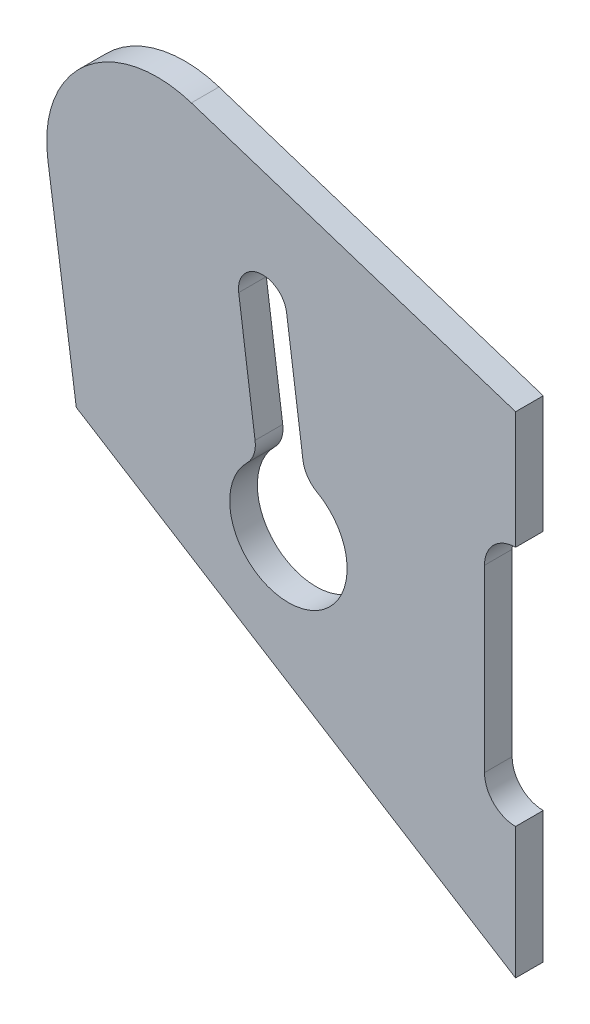
ISO-10303-21;
HEADER;
FILE_DESCRIPTION(('STEP AP214'),'2;1');
FILE_NAME('part.step','',(''),(''),'','','');
FILE_SCHEMA(('AUTOMOTIVE_DESIGN { 1 0 10303 214 1 1 1 1 }'));
ENDSEC;
DATA;
#1=APPLICATION_CONTEXT('core data for automotive mechanical design processes');
#2=APPLICATION_PROTOCOL_DEFINITION('international standard','automotive_design',2000,#1);
#3=PRODUCT_CONTEXT('',#1,'mechanical');
#4=PRODUCT('Part','Part','',(#3));
#5=PRODUCT_RELATED_PRODUCT_CATEGORY('part','',(#4));
#6=PRODUCT_DEFINITION_FORMATION('','',#4);
#7=PRODUCT_DEFINITION_CONTEXT('part definition',#1,'design');
#8=PRODUCT_DEFINITION('design','',#6,#7);
#9=PRODUCT_DEFINITION_SHAPE('','',#8);
#10=(LENGTH_UNIT() NAMED_UNIT(*) SI_UNIT(.MILLI.,.METRE.));
#11=(NAMED_UNIT(*) PLANE_ANGLE_UNIT() SI_UNIT($,.RADIAN.));
#12=(NAMED_UNIT(*) SI_UNIT($,.STERADIAN.) SOLID_ANGLE_UNIT());
#13=UNCERTAINTY_MEASURE_WITH_UNIT(LENGTH_MEASURE(1.E-05),#10,'distance_accuracy_value','');
#14=(GEOMETRIC_REPRESENTATION_CONTEXT(3) GLOBAL_UNCERTAINTY_ASSIGNED_CONTEXT((#13)) GLOBAL_UNIT_ASSIGNED_CONTEXT((#10,
#11,#12)) REPRESENTATION_CONTEXT('',''));
#15=CARTESIAN_POINT('',(0.,0.,0.));
#16=DIRECTION('',(0.,0.,1.));
#17=DIRECTION('',(1.,0.,0.));
#18=AXIS2_PLACEMENT_3D('',#15,#16,#17);
#19=CARTESIAN_POINT('',(-47.1056972620298,-6.45501762164483,8.));
#20=DIRECTION('',(0.990741222484138,0.135763876162386,0.));
#21=DIRECTION('',(-0.135763876162386,0.990741222484138,0.));
#22=AXIS2_PLACEMENT_3D('',#19,#20,#21);
#23=PLANE('',#22);
#24=DIRECTION('',(0.135763876162386,-0.990741222484138,0.));
#25=VECTOR('',#24,1.);
#26=CARTESIAN_POINT('',(-47.1056972620298,-6.45501762164483,0.));
#27=LINE('',#26,#25);
#28=CARTESIAN_POINT('',(-66.3095583813064,133.685772252171,0.));
#29=VERTEX_POINT('',#28);
#30=CARTESIAN_POINT('',(-61.5578227156229,99.0098294652265,0.));
#31=VERTEX_POINT('',#30);
#32=EDGE_CURVE('E211',#29,#31,#27,.T.);
#33=ORIENTED_EDGE('',*,*,#32,.T.);
#34=DIRECTION('',(0.,0.,-1.));
#35=VECTOR('',#34,1.);
#36=CARTESIAN_POINT('',(-61.5578227156229,99.0098294652265,8.));
#37=LINE('',#36,#35);
#38=CARTESIAN_POINT('',(-61.5578227156229,99.0098294652265,8.));
#39=VERTEX_POINT('',#38);
#40=EDGE_CURVE('E11',#39,#31,#37,.T.);
#41=ORIENTED_EDGE('',*,*,#40,.F.);
#42=DIRECTION('',(0.135763876162386,-0.990741222484138,0.));
#43=VECTOR('',#42,1.);
#44=CARTESIAN_POINT('',(-47.1056972620298,-6.45501762164483,8.));
#45=LINE('',#44,#43);
#46=CARTESIAN_POINT('',(-66.3095583813064,133.685772252171,8.));
#47=VERTEX_POINT('',#46);
#48=EDGE_CURVE('E433',#47,#39,#45,.T.);
#49=ORIENTED_EDGE('',*,*,#48,.F.);
#50=DIRECTION('',(0.,0.,-1.));
#51=VECTOR('',#50,1.);
#52=CARTESIAN_POINT('',(-66.3095583813064,133.685772252171,8.));
#53=LINE('',#52,#51);
#54=EDGE_CURVE('E60',#47,#29,#53,.T.);
#55=ORIENTED_EDGE('',*,*,#54,.T.);
#56=EDGE_LOOP('',(#33,#41,#49,#55));
#57=FACE_BOUND('',#56,.T.);
#58=ADVANCED_FACE('F41',(#57),#23,.F.);
#59=CARTESIAN_POINT('',(-53.6318929357498,100.095940474526,8.));
#60=DIRECTION('',(0.,0.,-1.));
#61=DIRECTION('',(-1.,0.,0.));
#62=AXIS2_PLACEMENT_3D('',#59,#60,#61);
#63=CYLINDRICAL_SURFACE('',#62,7.99999999999998);
#64=CARTESIAN_POINT('',(-53.6318929357498,100.095940474526,0.));
#65=DIRECTION('',(0.,0.,1.));
#66=DIRECTION('',(1.,0.,0.));
#67=AXIS2_PLACEMENT_3D('',#64,#65,#66);
#68=CIRCLE('',#67,7.99999999999998);
#69=CARTESIAN_POINT('',(-57.5185619962344,93.1035300450476,0.));
#70=VERTEX_POINT('',#69);
#71=EDGE_CURVE('E213',#31,#70,#68,.T.);
#72=ORIENTED_EDGE('',*,*,#71,.T.);
#73=DIRECTION('',(0.,0.,-1.));
#74=VECTOR('',#73,1.);
#75=CARTESIAN_POINT('',(-57.5185619962344,93.1035300450476,8.));
#76=LINE('',#75,#74);
#77=CARTESIAN_POINT('',(-57.5185619962344,93.1035300450476,8.));
#78=VERTEX_POINT('',#77);
#79=EDGE_CURVE('E51',#78,#70,#76,.T.);
#80=ORIENTED_EDGE('',*,*,#79,.F.);
#81=CARTESIAN_POINT('',(-53.6318929357498,100.095940474526,8.));
#82=DIRECTION('',(0.,0.,1.));
#83=DIRECTION('',(1.,0.,0.));
#84=AXIS2_PLACEMENT_3D('',#81,#82,#83);
#85=CIRCLE('',#84,7.99999999999998);
#86=EDGE_CURVE('E434',#39,#78,#85,.T.);
#87=ORIENTED_EDGE('',*,*,#86,.F.);
#88=ORIENTED_EDGE('',*,*,#40,.T.);
#89=EDGE_LOOP('',(#72,#80,#87,#88));
#90=FACE_BOUND('',#89,.T.);
#91=ADVANCED_FACE('F297',(#90),#63,.T.);
#92=CARTESIAN_POINT('',(-65.7777337497642,78.244657882407,8.));
#93=DIRECTION('',(0.,0.,-1.));
#94=DIRECTION('',(-1.,0.,0.));
#95=AXIS2_PLACEMENT_3D('',#92,#93,#94);
#96=CYLINDRICAL_SURFACE('',#95,17.);
#97=CARTESIAN_POINT('',(-65.7777337497642,78.244657882407,0.));
#98=DIRECTION('',(0.,0.,1.));
#99=DIRECTION('',(1.,0.,0.));
#100=AXIS2_PLACEMENT_3D('',#97,#98,#99);
#101=CIRCLE('',#100,17.);
#102=CARTESIAN_POINT('',(-77.7296829349108,90.333946971335,0.));
#103=VERTEX_POINT('',#102);
#104=EDGE_CURVE('E216',#103,#70,#101,.T.);
#105=ORIENTED_EDGE('',*,*,#104,.F.);
#106=DIRECTION('',(0.,0.,-1.));
#107=VECTOR('',#106,1.);
#108=CARTESIAN_POINT('',(-77.7296829349108,90.333946971335,8.));
#109=LINE('',#108,#107);
#110=CARTESIAN_POINT('',(-77.7296829349108,90.333946971335,8.));
#111=VERTEX_POINT('',#110);
#112=EDGE_CURVE('E166',#111,#103,#109,.T.);
#113=ORIENTED_EDGE('',*,*,#112,.F.);
#114=CARTESIAN_POINT('',(-65.7777337497642,78.244657882407,8.));
#115=DIRECTION('',(0.,0.,1.));
#116=DIRECTION('',(1.,0.,0.));
#117=AXIS2_PLACEMENT_3D('',#114,#115,#116);
#118=CIRCLE('',#117,17.);
#119=EDGE_CURVE('E176',#111,#78,#118,.T.);
#120=ORIENTED_EDGE('',*,*,#119,.T.);
#121=ORIENTED_EDGE('',*,*,#79,.T.);
#122=EDGE_LOOP('',(#105,#113,#120,#121));
#123=FACE_BOUND('',#122,.T.);
#124=ADVANCED_FACE('F302',(#123),#96,.F.);
#125=CARTESIAN_POINT('',(-83.3541296102739,96.0230241896541,8.));
#126=DIRECTION('',(0.,0.,-1.));
#127=DIRECTION('',(-1.,0.,0.));
#128=AXIS2_PLACEMENT_3D('',#125,#126,#127);
#129=CYLINDRICAL_SURFACE('',#128,8.);
#130=CARTESIAN_POINT('',(-83.3541296102739,96.0230241896541,0.));
#131=DIRECTION('',(0.,0.,1.));
#132=DIRECTION('',(1.,0.,0.));
#133=AXIS2_PLACEMENT_3D('',#130,#131,#132);
#134=CIRCLE('',#133,8.);
#135=CARTESIAN_POINT('',(-75.4281998304008,97.1091351989531,0.));
#136=VERTEX_POINT('',#135);
#137=EDGE_CURVE('E162',#136,#103,#134,.F.);
#138=ORIENTED_EDGE('',*,*,#137,.F.);
#139=DIRECTION('',(0.,0.,-1.));
#140=VECTOR('',#139,1.);
#141=CARTESIAN_POINT('',(-75.4281998304008,97.1091351989531,8.));
#142=LINE('',#141,#140);
#143=CARTESIAN_POINT('',(-75.4281998304008,97.1091351989531,8.));
#144=VERTEX_POINT('',#143);
#145=EDGE_CURVE('E157',#144,#136,#142,.T.);
#146=ORIENTED_EDGE('',*,*,#145,.F.);
#147=CARTESIAN_POINT('',(-83.3541296102739,96.0230241896541,8.));
#148=DIRECTION('',(0.,0.,1.));
#149=DIRECTION('',(1.,0.,0.));
#150=AXIS2_PLACEMENT_3D('',#147,#148,#149);
#151=CIRCLE('',#150,8.);
#152=EDGE_CURVE('E160',#144,#111,#151,.F.);
#153=ORIENTED_EDGE('',*,*,#152,.T.);
#154=ORIENTED_EDGE('',*,*,#112,.T.);
#155=EDGE_LOOP('',(#138,#146,#153,#154));
#156=FACE_BOUND('',#155,.T.);
#157=ADVANCED_FACE('F159',(#156),#129,.T.);
#158=CARTESIAN_POINT('',(-60.9760743768078,-8.35571188791821,8.));
#159=DIRECTION('',(0.990741222484138,0.135763876162385,0.));
#160=DIRECTION('',(-0.135763876162385,0.990741222484138,0.));
#161=AXIS2_PLACEMENT_3D('',#158,#159,#160);
#162=PLANE('',#161);
#163=DIRECTION('',(0.135763876162385,-0.990741222484138,0.));
#164=VECTOR('',#163,1.);
#165=CARTESIAN_POINT('',(-60.9760743768078,-8.35571188791821,0.));
#166=LINE('',#165,#164);
#167=CARTESIAN_POINT('',(-80.1799354960843,131.785077985898,0.));
#168=VERTEX_POINT('',#167);
#169=EDGE_CURVE('E220',#168,#136,#166,.T.);
#170=ORIENTED_EDGE('',*,*,#169,.F.);
#171=DIRECTION('',(0.,0.,-1.));
#172=VECTOR('',#171,1.);
#173=CARTESIAN_POINT('',(-80.1799354960843,131.785077985898,8.));
#174=LINE('',#173,#172);
#175=CARTESIAN_POINT('',(-80.1799354960843,131.785077985898,8.));
#176=VERTEX_POINT('',#175);
#177=EDGE_CURVE('E107',#176,#168,#174,.T.);
#178=ORIENTED_EDGE('',*,*,#177,.F.);
#179=DIRECTION('',(0.135763876162385,-0.990741222484138,0.));
#180=VECTOR('',#179,1.);
#181=CARTESIAN_POINT('',(-60.9760743768078,-8.35571188791821,8.));
#182=LINE('',#181,#180);
#183=EDGE_CURVE('E174',#176,#144,#182,.T.);
#184=ORIENTED_EDGE('',*,*,#183,.T.);
#185=ORIENTED_EDGE('',*,*,#145,.T.);
#186=EDGE_LOOP('',(#170,#178,#184,#185));
#187=FACE_BOUND('',#186,.T.);
#188=ADVANCED_FACE('F178',(#187),#162,.T.);
#189=CARTESIAN_POINT('',(41.7327748483136,128.440193543228,8.));
#190=DIRECTION('',(-0.309017169705247,-0.951056459326868,0.));
#191=DIRECTION('',(0.951056459326868,-0.309017169705247,0.));
#192=AXIS2_PLACEMENT_3D('',#189,#190,#191);
#193=PLANE('',#192);
#194=DIRECTION('',(-0.951056459326868,0.309017169705247,0.));
#195=VECTOR('',#194,1.);
#196=CARTESIAN_POINT('',(41.7327748483136,128.440193543228,0.));
#197=LINE('',#196,#195);
#198=CARTESIAN_POINT('',(7.92718706155898E-06,142.,0.));
#199=VERTEX_POINT('',#198);
#200=CARTESIAN_POINT('',(-93.8802542553691,172.503565404911,0.));
#201=VERTEX_POINT('',#200);
#202=EDGE_CURVE('E185',#199,#201,#197,.T.);
#203=ORIENTED_EDGE('',*,*,#202,.T.);
#204=DIRECTION('',(0.,0.,-1.));
#205=VECTOR('',#204,1.);
#206=CARTESIAN_POINT('',(-93.8802542553691,172.503565404911,8.));
#207=LINE('',#206,#205);
#208=CARTESIAN_POINT('',(-93.8802542553691,172.503565404911,8.));
#209=VERTEX_POINT('',#208);
#210=EDGE_CURVE('E45',#209,#201,#207,.T.);
#211=ORIENTED_EDGE('',*,*,#210,.F.);
#212=DIRECTION('',(-0.951056459326868,0.309017169705247,0.));
#213=VECTOR('',#212,1.);
#214=CARTESIAN_POINT('',(41.7327748483136,128.440193543228,8.));
#215=LINE('',#214,#213);
#216=CARTESIAN_POINT('',(7.92718706155898E-06,142.,8.));
#217=VERTEX_POINT('',#216);
#218=EDGE_CURVE('E225',#217,#209,#215,.T.);
#219=ORIENTED_EDGE('',*,*,#218,.F.);
#220=DIRECTION('',(0.,0.,-1.));
#221=VECTOR('',#220,1.);
#222=CARTESIAN_POINT('',(7.92718706155898E-06,142.,8.));
#223=LINE('',#222,#221);
#224=EDGE_CURVE('E181',#217,#199,#223,.T.);
#225=ORIENTED_EDGE('',*,*,#224,.T.);
#226=EDGE_LOOP('',(#203,#211,#219,#225));
#227=FACE_BOUND('',#226,.T.);
#228=ADVANCED_FACE('F43',(#227),#193,.F.);
#229=CARTESIAN_POINT('',(-103.768803685937,142.069758706451,8.));
#230=DIRECTION('',(0.,0.,-1.));
#231=DIRECTION('',(-1.,0.,0.));
#232=AXIS2_PLACEMENT_3D('',#229,#230,#231);
#233=CYLINDRICAL_SURFACE('',#232,32.);
#234=CARTESIAN_POINT('',(-103.768803685937,142.069758706451,0.));
#235=DIRECTION('',(0.,0.,1.));
#236=DIRECTION('',(1.,0.,0.));
#237=AXIS2_PLACEMENT_3D('',#234,#235,#236);
#238=CIRCLE('',#237,32.);
#239=CARTESIAN_POINT('',(-135.451283482299,137.573040575069,0.));
#240=VERTEX_POINT('',#239);
#241=EDGE_CURVE('E188',#201,#240,#238,.T.);
#242=ORIENTED_EDGE('',*,*,#241,.T.);
#243=DIRECTION('',(0.,0.,-1.));
#244=VECTOR('',#243,1.);
#245=CARTESIAN_POINT('',(-135.451283482299,137.573040575069,8.));
#246=LINE('',#245,#244);
#247=CARTESIAN_POINT('',(-135.451283482299,137.573040575069,8.));
#248=VERTEX_POINT('',#247);
#249=EDGE_CURVE('E243',#248,#240,#246,.T.);
#250=ORIENTED_EDGE('',*,*,#249,.F.);
#251=CARTESIAN_POINT('',(-103.768803685937,142.069758706451,8.));
#252=DIRECTION('',(0.,0.,1.));
#253=DIRECTION('',(1.,0.,0.));
#254=AXIS2_PLACEMENT_3D('',#251,#252,#253);
#255=CIRCLE('',#254,32.);
#256=EDGE_CURVE('E120',#209,#248,#255,.T.);
#257=ORIENTED_EDGE('',*,*,#256,.F.);
#258=ORIENTED_EDGE('',*,*,#210,.T.);
#259=EDGE_LOOP('',(#242,#250,#257,#258));
#260=FACE_BOUND('',#259,.T.);
#261=ADVANCED_FACE('F248',(#260),#233,.T.);
#262=CARTESIAN_POINT('',(-113.636310367362,-16.128486800801,8.));
#263=DIRECTION('',(-0.990077493636319,-0.140522441605688,0.));
#264=DIRECTION('',(0.140522441605688,-0.990077493636319,0.));
#265=AXIS2_PLACEMENT_3D('',#262,#263,#264);
#266=PLANE('',#265);
#267=DIRECTION('',(-0.140522441605688,0.990077493636319,0.));
#268=VECTOR('',#267,1.);
#269=CARTESIAN_POINT('',(-113.636310367362,-16.128486800801,0.));
#270=LINE('',#269,#268);
#271=CARTESIAN_POINT('',(-127.207214423464,79.4878896349804,0.));
#272=VERTEX_POINT('',#271);
#273=EDGE_CURVE('E191',#272,#240,#270,.T.);
#274=ORIENTED_EDGE('',*,*,#273,.F.);
#275=DIRECTION('',(0.,0.,-1.));
#276=VECTOR('',#275,1.);
#277=CARTESIAN_POINT('',(-127.207214423464,79.4878896349804,8.));
#278=LINE('',#277,#276);
#279=CARTESIAN_POINT('',(-127.207214423464,79.4878896349804,8.));
#280=VERTEX_POINT('',#279);
#281=EDGE_CURVE('E242',#280,#272,#278,.T.);
#282=ORIENTED_EDGE('',*,*,#281,.F.);
#283=DIRECTION('',(-0.140522441605688,0.990077493636319,0.));
#284=VECTOR('',#283,1.);
#285=CARTESIAN_POINT('',(-113.636310367362,-16.128486800801,8.));
#286=LINE('',#285,#284);
#287=EDGE_CURVE('E447',#280,#248,#286,.T.);
#288=ORIENTED_EDGE('',*,*,#287,.T.);
#289=ORIENTED_EDGE('',*,*,#249,.T.);
#290=EDGE_LOOP('',(#274,#282,#288,#289));
#291=FACE_BOUND('',#290,.T.);
#292=ADVANCED_FACE('F288',(#291),#266,.T.);
#293=CARTESIAN_POINT('',(0.,0.,8.));
#294=DIRECTION('',(-0.529919264233203,-0.848048096156428,0.));
#295=DIRECTION('',(0.848048096156428,-0.529919264233203,0.));
#296=AXIS2_PLACEMENT_3D('',#293,#294,#295);
#297=PLANE('',#296);
#298=DIRECTION('',(-0.848048096156428,0.529919264233203,0.));
#299=VECTOR('',#298,1.);
#300=CARTESIAN_POINT('',(0.,0.,0.));
#301=LINE('',#300,#299);
#302=CARTESIAN_POINT('',(0.,0.,0.));
#303=VERTEX_POINT('',#302);
#304=EDGE_CURVE('E194',#303,#272,#301,.T.);
#305=ORIENTED_EDGE('',*,*,#304,.F.);
#306=DIRECTION('',(0.,0.,-1.));
#307=VECTOR('',#306,1.);
#308=CARTESIAN_POINT('',(0.,0.,8.));
#309=LINE('',#308,#307);
#310=CARTESIAN_POINT('',(0.,0.,8.));
#311=VERTEX_POINT('',#310);
#312=EDGE_CURVE('E240',#311,#303,#309,.T.);
#313=ORIENTED_EDGE('',*,*,#312,.F.);
#314=DIRECTION('',(-0.848048096156428,0.529919264233203,0.));
#315=VECTOR('',#314,1.);
#316=CARTESIAN_POINT('',(0.,0.,8.));
#317=LINE('',#316,#315);
#318=EDGE_CURVE('E286',#311,#280,#317,.T.);
#319=ORIENTED_EDGE('',*,*,#318,.T.);
#320=ORIENTED_EDGE('',*,*,#281,.T.);
#321=EDGE_LOOP('',(#305,#313,#319,#320));
#322=FACE_BOUND('',#321,.T.);
#323=ADVANCED_FACE('F283',(#322),#297,.T.);
#324=CARTESIAN_POINT('',(0.,0.,8.));
#325=DIRECTION('',(-1.,0.,0.));
#326=DIRECTION('',(0.,0.,1.));
#327=AXIS2_PLACEMENT_3D('',#324,#325,#326);
#328=PLANE('',#327);
#329=DIRECTION('',(0.,1.,0.));
#330=VECTOR('',#329,1.);
#331=CARTESIAN_POINT('',(0.,0.,0.));
#332=LINE('',#331,#330);
#333=CARTESIAN_POINT('',(0.,38.,0.));
#334=VERTEX_POINT('',#333);
#335=EDGE_CURVE('E197',#303,#334,#332,.T.);
#336=ORIENTED_EDGE('',*,*,#335,.T.);
#337=DIRECTION('',(0.,0.,-1.));
#338=VECTOR('',#337,1.);
#339=CARTESIAN_POINT('',(0.,38.,8.));
#340=LINE('',#339,#338);
#341=CARTESIAN_POINT('',(0.,38.,8.));
#342=VERTEX_POINT('',#341);
#343=EDGE_CURVE('E238',#342,#334,#340,.T.);
#344=ORIENTED_EDGE('',*,*,#343,.F.);
#345=DIRECTION('',(0.,1.,0.));
#346=VECTOR('',#345,1.);
#347=CARTESIAN_POINT('',(0.,0.,8.));
#348=LINE('',#347,#346);
#349=EDGE_CURVE('E444',#311,#342,#348,.T.);
#350=ORIENTED_EDGE('',*,*,#349,.F.);
#351=ORIENTED_EDGE('',*,*,#312,.T.);
#352=EDGE_LOOP('',(#336,#344,#350,#351));
#353=FACE_BOUND('',#352,.T.);
#354=ADVANCED_FACE('F280',(#353),#328,.F.);
#355=CARTESIAN_POINT('',(0.,47.,8.));
#356=DIRECTION('',(0.,0.,-1.));
#357=DIRECTION('',(-1.,0.,0.));
#358=AXIS2_PLACEMENT_3D('',#355,#356,#357);
#359=CYLINDRICAL_SURFACE('',#358,9.);
#360=CARTESIAN_POINT('',(0.,47.,0.));
#361=DIRECTION('',(0.,0.,1.));
#362=DIRECTION('',(1.,0.,0.));
#363=AXIS2_PLACEMENT_3D('',#360,#361,#362);
#364=CIRCLE('',#363,9.);
#365=CARTESIAN_POINT('',(-9.,47.,0.));
#366=VERTEX_POINT('',#365);
#367=EDGE_CURVE('E200',#366,#334,#364,.T.);
#368=ORIENTED_EDGE('',*,*,#367,.F.);
#369=DIRECTION('',(0.,0.,-1.));
#370=VECTOR('',#369,1.);
#371=CARTESIAN_POINT('',(-9.,47.,8.));
#372=LINE('',#371,#370);
#373=CARTESIAN_POINT('',(-9.,47.,8.));
#374=VERTEX_POINT('',#373);
#375=EDGE_CURVE('E236',#374,#366,#372,.T.);
#376=ORIENTED_EDGE('',*,*,#375,.F.);
#377=CARTESIAN_POINT('',(0.,47.,8.));
#378=DIRECTION('',(0.,0.,1.));
#379=DIRECTION('',(1.,0.,0.));
#380=AXIS2_PLACEMENT_3D('',#377,#378,#379);
#381=CIRCLE('',#380,9.);
#382=EDGE_CURVE('E277',#374,#342,#381,.T.);
#383=ORIENTED_EDGE('',*,*,#382,.T.);
#384=ORIENTED_EDGE('',*,*,#343,.T.);
#385=EDGE_LOOP('',(#368,#376,#383,#384));
#386=FACE_BOUND('',#385,.T.);
#387=ADVANCED_FACE('F272',(#386),#359,.F.);
#388=CARTESIAN_POINT('',(-9.,0.,8.));
#389=DIRECTION('',(-1.,0.,0.));
#390=DIRECTION('',(0.,-1.,0.));
#391=AXIS2_PLACEMENT_3D('',#388,#389,#390);
#392=PLANE('',#391);
#393=DIRECTION('',(0.,1.,0.));
#394=VECTOR('',#393,1.);
#395=CARTESIAN_POINT('',(-9.,0.,0.));
#396=LINE('',#395,#394);
#397=CARTESIAN_POINT('',(-9.,99.,0.));
#398=VERTEX_POINT('',#397);
#399=EDGE_CURVE('E203',#366,#398,#396,.T.);
#400=ORIENTED_EDGE('',*,*,#399,.T.);
#401=DIRECTION('',(0.,0.,-1.));
#402=VECTOR('',#401,1.);
#403=CARTESIAN_POINT('',(-9.,99.,8.));
#404=LINE('',#403,#402);
#405=CARTESIAN_POINT('',(-9.,99.,8.));
#406=VERTEX_POINT('',#405);
#407=EDGE_CURVE('E233',#406,#398,#404,.T.);
#408=ORIENTED_EDGE('',*,*,#407,.F.);
#409=DIRECTION('',(0.,1.,0.));
#410=VECTOR('',#409,1.);
#411=CARTESIAN_POINT('',(-9.,0.,8.));
#412=LINE('',#411,#410);
#413=EDGE_CURVE('E441',#374,#406,#412,.T.);
#414=ORIENTED_EDGE('',*,*,#413,.F.);
#415=ORIENTED_EDGE('',*,*,#375,.T.);
#416=EDGE_LOOP('',(#400,#408,#414,#415));
#417=FACE_BOUND('',#416,.T.);
#418=ADVANCED_FACE('F312',(#417),#392,.F.);
#419=CARTESIAN_POINT('',(0.,99.,8.));
#420=DIRECTION('',(0.,0.,-1.));
#421=DIRECTION('',(-1.,0.,0.));
#422=AXIS2_PLACEMENT_3D('',#419,#420,#421);
#423=CYLINDRICAL_SURFACE('',#422,9.);
#424=CARTESIAN_POINT('',(0.,99.,0.));
#425=DIRECTION('',(0.,0.,1.));
#426=DIRECTION('',(1.,0.,0.));
#427=AXIS2_PLACEMENT_3D('',#424,#425,#426);
#428=CIRCLE('',#427,9.);
#429=CARTESIAN_POINT('',(1.65917866959084E-06,108.,0.));
#430=VERTEX_POINT('',#429);
#431=EDGE_CURVE('E205',#398,#430,#428,.F.);
#432=ORIENTED_EDGE('',*,*,#431,.T.);
#433=DIRECTION('',(0.,0.,-1.));
#434=VECTOR('',#433,1.);
#435=CARTESIAN_POINT('',(1.65917866959084E-06,108.,8.));
#436=LINE('',#435,#434);
#437=CARTESIAN_POINT('',(1.65917866959084E-06,108.,8.));
#438=VERTEX_POINT('',#437);
#439=EDGE_CURVE('E231',#438,#430,#436,.T.);
#440=ORIENTED_EDGE('',*,*,#439,.F.);
#441=CARTESIAN_POINT('',(0.,99.,8.));
#442=DIRECTION('',(0.,0.,1.));
#443=DIRECTION('',(1.,0.,0.));
#444=AXIS2_PLACEMENT_3D('',#441,#442,#443);
#445=CIRCLE('',#444,9.);
#446=EDGE_CURVE('E437',#406,#438,#445,.F.);
#447=ORIENTED_EDGE('',*,*,#446,.F.);
#448=ORIENTED_EDGE('',*,*,#407,.T.);
#449=EDGE_LOOP('',(#432,#440,#447,#448));
#450=FACE_BOUND('',#449,.T.);
#451=ADVANCED_FACE('F265',(#450),#423,.F.);
#452=CARTESIAN_POINT('',(-1.82509656343073E-05,3.3646236987459E-12,8.));
#453=DIRECTION('',(0.999999999999983,-1.8435318799906E-07,0.));
#454=DIRECTION('',(1.8435318799906E-07,0.999999999999983,0.));
#455=AXIS2_PLACEMENT_3D('',#452,#453,#454);
#456=PLANE('',#455);
#457=DIRECTION('',(-1.8435318799906E-07,-0.999999999999983,0.));
#458=VECTOR('',#457,1.);
#459=CARTESIAN_POINT('',(-1.82509656343073E-05,3.3646236987459E-12,0.));
#460=LINE('',#459,#458);
#461=EDGE_CURVE('E208',#199,#430,#460,.T.);
#462=ORIENTED_EDGE('',*,*,#461,.F.);
#463=ORIENTED_EDGE('',*,*,#224,.F.);
#464=DIRECTION('',(-1.8435318799906E-07,-0.999999999999983,0.));
#465=VECTOR('',#464,1.);
#466=CARTESIAN_POINT('',(-1.82509656343073E-05,3.3646236987459E-12,8.));
#467=LINE('',#466,#465);
#468=EDGE_CURVE('E262',#217,#438,#467,.T.);
#469=ORIENTED_EDGE('',*,*,#468,.T.);
#470=ORIENTED_EDGE('',*,*,#439,.T.);
#471=EDGE_LOOP('',(#462,#463,#469,#470));
#472=FACE_BOUND('',#471,.T.);
#473=ADVANCED_FACE('F258',(#472),#456,.T.);
#474=CARTESIAN_POINT('',(-73.2447469386954,132.735425119035,8.));
#475=DIRECTION('',(0.,0.,-1.));
#476=DIRECTION('',(-1.,0.,0.));
#477=AXIS2_PLACEMENT_3D('',#474,#475,#476);
#478=CYLINDRICAL_SURFACE('',#477,6.99999999999999);
#479=CARTESIAN_POINT('',(-73.2447469386954,132.735425119035,0.));
#480=DIRECTION('',(0.,0.,1.));
#481=DIRECTION('',(1.,0.,0.));
#482=AXIS2_PLACEMENT_3D('',#479,#480,#481);
#483=CIRCLE('',#482,6.99999999999999);
#484=EDGE_CURVE('E222',#29,#168,#483,.T.);
#485=ORIENTED_EDGE('',*,*,#484,.F.);
#486=ORIENTED_EDGE('',*,*,#54,.F.);
#487=CARTESIAN_POINT('',(-73.2447469386954,132.735425119035,8.));
#488=DIRECTION('',(0.,0.,1.));
#489=DIRECTION('',(1.,0.,0.));
#490=AXIS2_PLACEMENT_3D('',#487,#488,#489);
#491=CIRCLE('',#490,6.99999999999999);
#492=EDGE_CURVE('E179',#47,#176,#491,.T.);
#493=ORIENTED_EDGE('',*,*,#492,.T.);
#494=ORIENTED_EDGE('',*,*,#177,.T.);
#495=EDGE_LOOP('',(#485,#486,#493,#494));
#496=FACE_BOUND('',#495,.T.);
#497=ADVANCED_FACE('F309',(#496),#478,.F.);
#498=CARTESIAN_POINT('',(0.,0.,8.));
#499=DIRECTION('',(0.,0.,1.));
#500=DIRECTION('',(1.,0.,0.));
#501=AXIS2_PLACEMENT_3D('',#498,#499,#500);
#502=PLANE('',#501);
#503=ORIENTED_EDGE('',*,*,#218,.T.);
#504=ORIENTED_EDGE('',*,*,#256,.T.);
#505=ORIENTED_EDGE('',*,*,#287,.F.);
#506=ORIENTED_EDGE('',*,*,#318,.F.);
#507=ORIENTED_EDGE('',*,*,#349,.T.);
#508=ORIENTED_EDGE('',*,*,#382,.F.);
#509=ORIENTED_EDGE('',*,*,#413,.T.);
#510=ORIENTED_EDGE('',*,*,#446,.T.);
#511=ORIENTED_EDGE('',*,*,#468,.F.);
#512=EDGE_LOOP('',(#503,#504,#505,#506,#507,#508,#509,#510,#511));
#513=FACE_BOUND('',#512,.T.);
#514=ORIENTED_EDGE('',*,*,#48,.T.);
#515=ORIENTED_EDGE('',*,*,#86,.T.);
#516=ORIENTED_EDGE('',*,*,#119,.F.);
#517=ORIENTED_EDGE('',*,*,#152,.F.);
#518=ORIENTED_EDGE('',*,*,#183,.F.);
#519=ORIENTED_EDGE('',*,*,#492,.F.);
#520=EDGE_LOOP('',(#514,#515,#516,#517,#518,#519));
#521=FACE_BOUND('',#520,.T.);
#522=ADVANCED_FACE('F172',(#513,#521),#502,.T.);
#523=CARTESIAN_POINT('',(0.,0.,0.));
#524=DIRECTION('',(0.,0.,1.));
#525=DIRECTION('',(1.,0.,0.));
#526=AXIS2_PLACEMENT_3D('',#523,#524,#525);
#527=PLANE('',#526);
#528=ORIENTED_EDGE('',*,*,#202,.F.);
#529=ORIENTED_EDGE('',*,*,#461,.T.);
#530=ORIENTED_EDGE('',*,*,#431,.F.);
#531=ORIENTED_EDGE('',*,*,#399,.F.);
#532=ORIENTED_EDGE('',*,*,#367,.T.);
#533=ORIENTED_EDGE('',*,*,#335,.F.);
#534=ORIENTED_EDGE('',*,*,#304,.T.);
#535=ORIENTED_EDGE('',*,*,#273,.T.);
#536=ORIENTED_EDGE('',*,*,#241,.F.);
#537=EDGE_LOOP('',(#528,#529,#530,#531,#532,#533,#534,#535,#536));
#538=FACE_BOUND('',#537,.T.);
#539=ORIENTED_EDGE('',*,*,#32,.F.);
#540=ORIENTED_EDGE('',*,*,#484,.T.);
#541=ORIENTED_EDGE('',*,*,#169,.T.);
#542=ORIENTED_EDGE('',*,*,#137,.T.);
#543=ORIENTED_EDGE('',*,*,#104,.T.);
#544=ORIENTED_EDGE('',*,*,#71,.F.);
#545=EDGE_LOOP('',(#539,#540,#541,#542,#543,#544));
#546=FACE_BOUND('',#545,.T.);
#547=ADVANCED_FACE('F254',(#538,#546),#527,.F.);
#548=CLOSED_SHELL('',(#58,#91,#124,#157,#188,#228,#261,#292,#323,#354,#387,#418,#451,#473,#497,
#522,#547));
#549=MANIFOLD_SOLID_BREP('B2',#548);
#550=ADVANCED_BREP_SHAPE_REPRESENTATION('',(#18,#549),#14);
#551=SHAPE_DEFINITION_REPRESENTATION(#9,#550);
ENDSEC;
END-ISO-10303-21;
